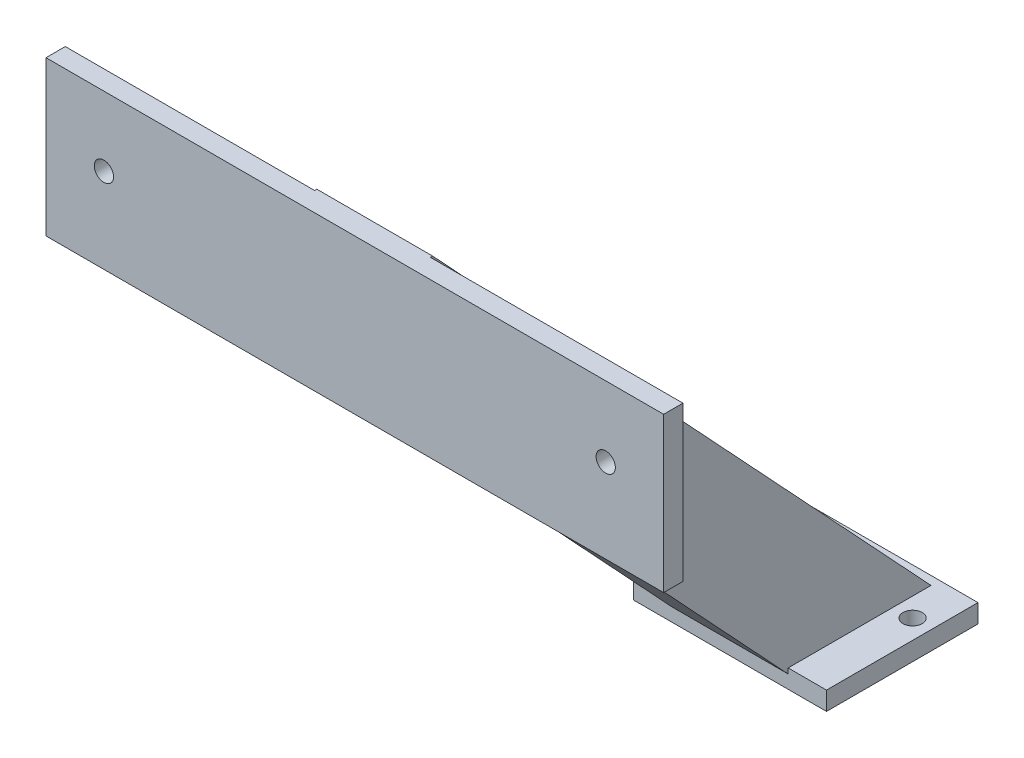
ISO-10303-21;
HEADER;
FILE_DESCRIPTION(('STEP AP214'),'2;1');
FILE_NAME('part.step','',(''),(''),'','','');
FILE_SCHEMA(('AUTOMOTIVE_DESIGN { 1 0 10303 214 1 1 1 1 }'));
ENDSEC;
DATA;
#1=APPLICATION_CONTEXT('core data for automotive mechanical design processes');
#2=APPLICATION_PROTOCOL_DEFINITION('international standard','automotive_design',2000,#1);
#3=PRODUCT_CONTEXT('',#1,'mechanical');
#4=PRODUCT('Part','Part','',(#3));
#5=PRODUCT_RELATED_PRODUCT_CATEGORY('part','',(#4));
#6=PRODUCT_DEFINITION_FORMATION('','',#4);
#7=PRODUCT_DEFINITION_CONTEXT('part definition',#1,'design');
#8=PRODUCT_DEFINITION('design','',#6,#7);
#9=PRODUCT_DEFINITION_SHAPE('','',#8);
#10=(LENGTH_UNIT() NAMED_UNIT(*) SI_UNIT(.MILLI.,.METRE.));
#11=(NAMED_UNIT(*) PLANE_ANGLE_UNIT() SI_UNIT($,.RADIAN.));
#12=(NAMED_UNIT(*) SI_UNIT($,.STERADIAN.) SOLID_ANGLE_UNIT());
#13=UNCERTAINTY_MEASURE_WITH_UNIT(LENGTH_MEASURE(1.E-05),#10,'distance_accuracy_value','');
#14=(GEOMETRIC_REPRESENTATION_CONTEXT(3) GLOBAL_UNCERTAINTY_ASSIGNED_CONTEXT((#13)) GLOBAL_UNIT_ASSIGNED_CONTEXT((#10,
#11,#12)) REPRESENTATION_CONTEXT('',''));
#15=CARTESIAN_POINT('',(0.,0.,0.));
#16=DIRECTION('',(0.,0.,1.));
#17=DIRECTION('',(1.,0.,0.));
#18=AXIS2_PLACEMENT_3D('',#15,#16,#17);
#19=CARTESIAN_POINT('',(-15.,29.5819050269431,2.8065790609284));
#20=DIRECTION('',(1.,0.,0.));
#21=DIRECTION('',(0.,0.,-1.));
#22=AXIS2_PLACEMENT_3D('',#19,#20,#21);
#23=PLANE('',#22);
#24=DIRECTION('',(0.,1.,0.));
#25=VECTOR('',#24,1.);
#26=CARTESIAN_POINT('',(-15.,29.5819050269431,-92.6751779747859));
#27=LINE('',#26,#25);
#28=CARTESIAN_POINT('',(-15.,-113.865560794245,-92.6751779747859));
#29=VERTEX_POINT('',#28);
#30=CARTESIAN_POINT('',(-15.,-112.503797371009,-92.6751779747859));
#31=VERTEX_POINT('',#30);
#32=EDGE_CURVE('E223',#29,#31,#27,.T.);
#33=ORIENTED_EDGE('',*,*,#32,.F.);
#34=DIRECTION('',(0.,0.731353701619169,0.6819983600625));
#35=VECTOR('',#34,1.);
#36=CARTESIAN_POINT('',(-15.,10.4859509451931,23.2844827062651));
#37=LINE('',#36,#35);
#38=CARTESIAN_POINT('',(-15.,-14.0500793261277,0.404264324328101));
#39=VERTEX_POINT('',#38);
#40=EDGE_CURVE('E253',#29,#39,#37,.T.);
#41=ORIENTED_EDGE('',*,*,#40,.T.);
#42=DIRECTION('',(0.,0.,-1.));
#43=VECTOR('',#42,1.);
#44=CARTESIAN_POINT('',(-15.,-14.0500793261277,5.));
#45=LINE('',#44,#43);
#46=CARTESIAN_POINT('',(-15.,-14.0500793261277,0.));
#47=VERTEX_POINT('',#46);
#48=EDGE_CURVE('E312',#39,#47,#45,.T.);
#49=ORIENTED_EDGE('',*,*,#48,.T.);
#50=DIRECTION('',(0.,1.,0.));
#51=VECTOR('',#50,1.);
#52=CARTESIAN_POINT('',(-15.,0.,0.));
#53=LINE('',#52,#51);
#54=CARTESIAN_POINT('',(-15.,25.9499206738723,0.));
#55=VERTEX_POINT('',#54);
#56=EDGE_CURVE('E249',#47,#55,#53,.T.);
#57=ORIENTED_EDGE('',*,*,#56,.T.);
#58=DIRECTION('',(0.,0.,1.));
#59=VECTOR('',#58,1.);
#60=CARTESIAN_POINT('',(-15.,25.9499206738723,-0.580301140926052));
#61=LINE('',#60,#59);
#62=CARTESIAN_POINT('',(-15.,25.9499206738723,-0.580301140926052));
#63=VERTEX_POINT('',#62);
#64=EDGE_CURVE('E328',#63,#55,#61,.T.);
#65=ORIENTED_EDGE('',*,*,#64,.F.);
#66=DIRECTION('',(0.,0.731353701619169,0.6819983600625));
#67=VECTOR('',#66,1.);
#68=CARTESIAN_POINT('',(-15.,29.5819050269431,2.8065790609284));
#69=LINE('',#68,#67);
#70=CARTESIAN_POINT('',(-15.,-112.503797371009,-129.690481949629));
#71=VERTEX_POINT('',#70);
#72=EDGE_CURVE('E324',#71,#63,#69,.T.);
#73=ORIENTED_EDGE('',*,*,#72,.F.);
#74=DIRECTION('',(0.,0.,-1.));
#75=VECTOR('',#74,1.);
#76=CARTESIAN_POINT('',(-15.,-112.503797371009,2.8065790609284));
#77=LINE('',#76,#75);
#78=EDGE_CURVE('E67',#31,#71,#77,.T.);
#79=ORIENTED_EDGE('',*,*,#78,.F.);
#80=EDGE_LOOP('',(#33,#41,#49,#57,#65,#73,#79));
#81=FACE_BOUND('',#80,.T.);
#82=ADVANCED_FACE('F43',(#81),#23,.F.);
#83=CARTESIAN_POINT('',(15.,29.5819050269431,2.8065790609284));
#84=DIRECTION('',(-1.,0.,0.));
#85=DIRECTION('',(0.,0.,1.));
#86=AXIS2_PLACEMENT_3D('',#83,#84,#85);
#87=PLANE('',#86);
#88=DIRECTION('',(0.,-1.,0.));
#89=VECTOR('',#88,1.);
#90=CARTESIAN_POINT('',(15.,29.5819050269431,-92.6751779747859));
#91=LINE('',#90,#89);
#92=CARTESIAN_POINT('',(15.,-112.503797371009,-92.6751779747859));
#93=VERTEX_POINT('',#92);
#94=CARTESIAN_POINT('',(15.,-113.865560794245,-92.6751779747859));
#95=VERTEX_POINT('',#94);
#96=EDGE_CURVE('E220',#93,#95,#91,.T.);
#97=ORIENTED_EDGE('',*,*,#96,.F.);
#98=DIRECTION('',(0.,0.,1.));
#99=VECTOR('',#98,1.);
#100=CARTESIAN_POINT('',(15.,-112.503797371009,2.8065790609284));
#101=LINE('',#100,#99);
#102=CARTESIAN_POINT('',(15.,-112.503797371009,-129.690481949629));
#103=VERTEX_POINT('',#102);
#104=EDGE_CURVE('E215',#103,#93,#101,.T.);
#105=ORIENTED_EDGE('',*,*,#104,.F.);
#106=DIRECTION('',(0.,-0.731353701619169,-0.6819983600625));
#107=VECTOR('',#106,1.);
#108=CARTESIAN_POINT('',(15.,29.5819050269431,2.8065790609284));
#109=LINE('',#108,#107);
#110=CARTESIAN_POINT('',(15.,25.9499206738723,-0.580301140926052));
#111=VERTEX_POINT('',#110);
#112=EDGE_CURVE('E320',#111,#103,#109,.T.);
#113=ORIENTED_EDGE('',*,*,#112,.F.);
#114=DIRECTION('',(0.,0.,1.));
#115=VECTOR('',#114,1.);
#116=CARTESIAN_POINT('',(15.,25.9499206738723,-0.580301140926052));
#117=LINE('',#116,#115);
#118=CARTESIAN_POINT('',(15.,25.9499206738723,0.));
#119=VERTEX_POINT('',#118);
#120=EDGE_CURVE('E259',#111,#119,#117,.T.);
#121=ORIENTED_EDGE('',*,*,#120,.T.);
#122=DIRECTION('',(0.,-1.,0.));
#123=VECTOR('',#122,1.);
#124=CARTESIAN_POINT('',(15.,0.,0.));
#125=LINE('',#124,#123);
#126=CARTESIAN_POINT('',(15.,-14.0500793261277,0.));
#127=VERTEX_POINT('',#126);
#128=EDGE_CURVE('E254',#119,#127,#125,.T.);
#129=ORIENTED_EDGE('',*,*,#128,.T.);
#130=DIRECTION('',(0.,0.,1.));
#131=VECTOR('',#130,1.);
#132=CARTESIAN_POINT('',(15.,-14.0500793261277,5.));
#133=LINE('',#132,#131);
#134=CARTESIAN_POINT('',(15.,-14.0500793261277,0.404264324328101));
#135=VERTEX_POINT('',#134);
#136=EDGE_CURVE('E258',#127,#135,#133,.T.);
#137=ORIENTED_EDGE('',*,*,#136,.T.);
#138=DIRECTION('',(0.,-0.731353701619169,-0.6819983600625));
#139=VECTOR('',#138,1.);
#140=CARTESIAN_POINT('',(15.,10.4859509451931,23.2844827062651));
#141=LINE('',#140,#139);
#142=EDGE_CURVE('E319',#135,#95,#141,.T.);
#143=ORIENTED_EDGE('',*,*,#142,.T.);
#144=EDGE_LOOP('',(#97,#105,#113,#121,#129,#137,#143));
#145=FACE_BOUND('',#144,.T.);
#146=ADVANCED_FACE('F392',(#145),#87,.F.);
#147=CARTESIAN_POINT('',(0.,-6.73663744663207,7.22415920854878));
#148=DIRECTION('',(0.,0.6819983600625,-0.731353701619169));
#149=DIRECTION('',(0.,0.731353701619169,0.6819983600625));
#150=AXIS2_PLACEMENT_3D('',#147,#148,#149);
#151=PLANE('',#150);
#152=DIRECTION('',(-1.,0.,0.));
#153=VECTOR('',#152,1.);
#154=CARTESIAN_POINT('',(0.,-113.865560794245,-92.6751779747859));
#155=LINE('',#154,#153);
#156=EDGE_CURVE('E11',#95,#29,#155,.T.);
#157=ORIENTED_EDGE('',*,*,#156,.F.);
#158=ORIENTED_EDGE('',*,*,#142,.F.);
#159=DIRECTION('',(-1.,0.,0.));
#160=VECTOR('',#159,1.);
#161=CARTESIAN_POINT('',(-79.5824804927821,-14.0500793261277,0.404264324328101));
#162=LINE('',#161,#160);
#163=EDGE_CURVE('E270',#135,#39,#162,.T.);
#164=ORIENTED_EDGE('',*,*,#163,.T.);
#165=ORIENTED_EDGE('',*,*,#40,.F.);
#166=EDGE_LOOP('',(#157,#158,#164,#165));
#167=FACE_BOUND('',#166,.T.);
#168=ADVANCED_FACE('F455',(#167),#151,.F.);
#169=CARTESIAN_POINT('',(0.,12.3593166351179,-13.253744436788));
#170=DIRECTION('',(0.,0.6819983600625,-0.731353701619169));
#171=DIRECTION('',(0.,0.731353701619169,0.6819983600625));
#172=AXIS2_PLACEMENT_3D('',#169,#170,#171);
#173=PLANE('',#172);
#174=ORIENTED_EDGE('',*,*,#112,.T.);
#175=DIRECTION('',(-1.,0.,0.));
#176=VECTOR('',#175,1.);
#177=CARTESIAN_POINT('',(0.,-112.503797371009,-129.690481949629));
#178=LINE('',#177,#176);
#179=EDGE_CURVE('E52',#103,#71,#178,.T.);
#180=ORIENTED_EDGE('',*,*,#179,.T.);
#181=ORIENTED_EDGE('',*,*,#72,.T.);
#182=DIRECTION('',(-1.,0.,0.));
#183=VECTOR('',#182,1.);
#184=CARTESIAN_POINT('',(15.,25.9499206738723,-0.580301140926052));
#185=LINE('',#184,#183);
#186=EDGE_CURVE('E329',#111,#63,#185,.T.);
#187=ORIENTED_EDGE('',*,*,#186,.F.);
#188=EDGE_LOOP('',(#174,#180,#181,#187));
#189=FACE_BOUND('',#188,.T.);
#190=ADVANCED_FACE('F352',(#189),#173,.T.);
#191=CARTESIAN_POINT('',(-79.5824804927821,-14.0500793261277,5.));
#192=DIRECTION('',(0.,1.,0.));
#193=DIRECTION('',(0.,0.,1.));
#194=AXIS2_PLACEMENT_3D('',#191,#192,#193);
#195=PLANE('',#194);
#196=ORIENTED_EDGE('',*,*,#48,.F.);
#197=ORIENTED_EDGE('',*,*,#163,.F.);
#198=ORIENTED_EDGE('',*,*,#136,.F.);
#199=DIRECTION('',(1.,0.,0.));
#200=VECTOR('',#199,1.);
#201=CARTESIAN_POINT('',(-79.5824804927821,-14.0500793261277,0.));
#202=LINE('',#201,#200);
#203=CARTESIAN_POINT('',(80.4175195072179,-14.0500793261277,0.));
#204=VERTEX_POINT('',#203);
#205=EDGE_CURVE('E265',#127,#204,#202,.T.);
#206=ORIENTED_EDGE('',*,*,#205,.T.);
#207=DIRECTION('',(0.,0.,-1.));
#208=VECTOR('',#207,1.);
#209=CARTESIAN_POINT('',(80.4175195072179,-14.0500793261277,5.));
#210=LINE('',#209,#208);
#211=CARTESIAN_POINT('',(80.4175195072179,-14.0500793261277,5.));
#212=VERTEX_POINT('',#211);
#213=EDGE_CURVE('E266',#212,#204,#210,.T.);
#214=ORIENTED_EDGE('',*,*,#213,.F.);
#215=DIRECTION('',(1.,0.,0.));
#216=VECTOR('',#215,1.);
#217=CARTESIAN_POINT('',(-79.5824804927821,-14.0500793261277,5.));
#218=LINE('',#217,#216);
#219=CARTESIAN_POINT('',(-79.5824804927821,-14.0500793261277,5.));
#220=VERTEX_POINT('',#219);
#221=EDGE_CURVE('E287',#220,#212,#218,.T.);
#222=ORIENTED_EDGE('',*,*,#221,.F.);
#223=DIRECTION('',(0.,0.,-1.));
#224=VECTOR('',#223,1.);
#225=CARTESIAN_POINT('',(-79.5824804927821,-14.0500793261277,5.));
#226=LINE('',#225,#224);
#227=CARTESIAN_POINT('',(-79.5824804927821,-14.0500793261277,0.));
#228=VERTEX_POINT('',#227);
#229=EDGE_CURVE('E260',#220,#228,#226,.T.);
#230=ORIENTED_EDGE('',*,*,#229,.T.);
#231=EDGE_CURVE('E264',#228,#47,#202,.T.);
#232=ORIENTED_EDGE('',*,*,#231,.T.);
#233=EDGE_LOOP('',(#196,#197,#198,#206,#214,#222,#230,#232));
#234=FACE_BOUND('',#233,.T.);
#235=ADVANCED_FACE('F367',(#234),#195,.F.);
#236=CARTESIAN_POINT('',(-79.5824804927821,25.9499206738723,5.));
#237=DIRECTION('',(0.,1.,0.));
#238=DIRECTION('',(0.,0.,1.));
#239=AXIS2_PLACEMENT_3D('',#236,#237,#238);
#240=PLANE('',#239);
#241=DIRECTION('',(1.,0.,0.));
#242=VECTOR('',#241,1.);
#243=CARTESIAN_POINT('',(-79.5824804927821,25.9499206738723,5.));
#244=LINE('',#243,#242);
#245=CARTESIAN_POINT('',(-79.5824804927821,25.9499206738723,5.));
#246=VERTEX_POINT('',#245);
#247=CARTESIAN_POINT('',(80.417519507218,25.9499206738723,5.));
#248=VERTEX_POINT('',#247);
#249=EDGE_CURVE('E277',#246,#248,#244,.T.);
#250=ORIENTED_EDGE('',*,*,#249,.T.);
#251=DIRECTION('',(0.,0.,-1.));
#252=VECTOR('',#251,1.);
#253=CARTESIAN_POINT('',(80.417519507218,25.9499206738723,5.));
#254=LINE('',#253,#252);
#255=CARTESIAN_POINT('',(80.417519507218,25.9499206738723,0.));
#256=VERTEX_POINT('',#255);
#257=EDGE_CURVE('E272',#248,#256,#254,.T.);
#258=ORIENTED_EDGE('',*,*,#257,.T.);
#259=DIRECTION('',(1.,0.,0.));
#260=VECTOR('',#259,1.);
#261=CARTESIAN_POINT('',(-79.5824804927821,25.9499206738723,0.));
#262=LINE('',#261,#260);
#263=EDGE_CURVE('E286',#119,#256,#262,.T.);
#264=ORIENTED_EDGE('',*,*,#263,.F.);
#265=ORIENTED_EDGE('',*,*,#120,.F.);
#266=ORIENTED_EDGE('',*,*,#186,.T.);
#267=ORIENTED_EDGE('',*,*,#64,.T.);
#268=CARTESIAN_POINT('',(-79.5824804927821,25.9499206738723,0.));
#269=VERTEX_POINT('',#268);
#270=EDGE_CURVE('E282',#269,#55,#262,.T.);
#271=ORIENTED_EDGE('',*,*,#270,.F.);
#272=DIRECTION('',(0.,0.,-1.));
#273=VECTOR('',#272,1.);
#274=CARTESIAN_POINT('',(-79.5824804927821,25.9499206738723,5.));
#275=LINE('',#274,#273);
#276=EDGE_CURVE('E278',#246,#269,#275,.T.);
#277=ORIENTED_EDGE('',*,*,#276,.F.);
#278=EDGE_LOOP('',(#250,#258,#264,#265,#266,#267,#271,#277));
#279=FACE_BOUND('',#278,.T.);
#280=ADVANCED_FACE('F378',(#279),#240,.T.);
#281=CARTESIAN_POINT('',(0.,0.,5.));
#282=DIRECTION('',(0.,0.,1.));
#283=DIRECTION('',(1.,0.,0.));
#284=AXIS2_PLACEMENT_3D('',#281,#282,#283);
#285=PLANE('',#284);
#286=CARTESIAN_POINT('',(65.4175195072179,7.73826469051745,5.));
#287=DIRECTION('',(0.,0.,1.));
#288=DIRECTION('',(1.,0.,0.));
#289=AXIS2_PLACEMENT_3D('',#286,#287,#288);
#290=CIRCLE('',#289,2.5);
#291=CARTESIAN_POINT('',(67.9175195072179,7.73826469051745,5.));
#292=VERTEX_POINT('',#291);
#293=EDGE_CURVE('E238',#292,#292,#290,.T.);
#294=ORIENTED_EDGE('',*,*,#293,.F.);
#295=EDGE_LOOP('',(#294));
#296=FACE_BOUND('',#295,.T.);
#297=CARTESIAN_POINT('',(-64.5824804927821,7.969479132061,5.));
#298=DIRECTION('',(0.,0.,1.));
#299=DIRECTION('',(1.,0.,0.));
#300=AXIS2_PLACEMENT_3D('',#297,#298,#299);
#301=CIRCLE('',#300,2.5);
#302=CARTESIAN_POINT('',(-62.0824804927821,7.969479132061,5.));
#303=VERTEX_POINT('',#302);
#304=EDGE_CURVE('E245',#303,#303,#301,.T.);
#305=ORIENTED_EDGE('',*,*,#304,.F.);
#306=EDGE_LOOP('',(#305));
#307=FACE_BOUND('',#306,.T.);
#308=DIRECTION('',(0.,-1.,0.));
#309=VECTOR('',#308,1.);
#310=CARTESIAN_POINT('',(80.417519507218,25.9499206738723,5.));
#311=LINE('',#310,#309);
#312=EDGE_CURVE('E271',#248,#212,#311,.T.);
#313=ORIENTED_EDGE('',*,*,#312,.F.);
#314=ORIENTED_EDGE('',*,*,#249,.F.);
#315=DIRECTION('',(0.,-1.,0.));
#316=VECTOR('',#315,1.);
#317=CARTESIAN_POINT('',(-79.5824804927821,25.9499206738723,5.));
#318=LINE('',#317,#316);
#319=EDGE_CURVE('E276',#246,#220,#318,.T.);
#320=ORIENTED_EDGE('',*,*,#319,.T.);
#321=ORIENTED_EDGE('',*,*,#221,.T.);
#322=EDGE_LOOP('',(#313,#314,#320,#321));
#323=FACE_BOUND('',#322,.T.);
#324=ADVANCED_FACE('F381',(#296,#307,#323),#285,.T.);
#325=CARTESIAN_POINT('',(0.,0.,0.));
#326=DIRECTION('',(0.,0.,1.));
#327=DIRECTION('',(1.,0.,0.));
#328=AXIS2_PLACEMENT_3D('',#325,#326,#327);
#329=PLANE('',#328);
#330=CARTESIAN_POINT('',(-64.5824804927821,7.969479132061,0.));
#331=DIRECTION('',(0.,0.,-1.));
#332=DIRECTION('',(-1.,0.,0.));
#333=AXIS2_PLACEMENT_3D('',#330,#331,#332);
#334=CIRCLE('',#333,2.5);
#335=CARTESIAN_POINT('',(-67.0824804927821,7.969479132061,0.));
#336=VERTEX_POINT('',#335);
#337=EDGE_CURVE('E233',#336,#336,#334,.T.);
#338=ORIENTED_EDGE('',*,*,#337,.F.);
#339=EDGE_LOOP('',(#338));
#340=FACE_BOUND('',#339,.T.);
#341=ORIENTED_EDGE('',*,*,#56,.F.);
#342=ORIENTED_EDGE('',*,*,#231,.F.);
#343=DIRECTION('',(0.,-1.,0.));
#344=VECTOR('',#343,1.);
#345=CARTESIAN_POINT('',(-79.5824804927821,25.9499206738723,0.));
#346=LINE('',#345,#344);
#347=EDGE_CURVE('E281',#269,#228,#346,.T.);
#348=ORIENTED_EDGE('',*,*,#347,.F.);
#349=ORIENTED_EDGE('',*,*,#270,.T.);
#350=EDGE_LOOP('',(#341,#342,#348,#349));
#351=FACE_BOUND('',#350,.T.);
#352=ADVANCED_FACE('F389',(#340,#351),#329,.F.);
#353=CARTESIAN_POINT('',(65.4175195072179,7.73826469051745,0.));
#354=DIRECTION('',(0.,0.,-1.));
#355=DIRECTION('',(-1.,0.,0.));
#356=AXIS2_PLACEMENT_3D('',#353,#354,#355);
#357=CIRCLE('',#356,2.5);
#358=CARTESIAN_POINT('',(62.9175195072179,7.73826469051745,0.));
#359=VERTEX_POINT('',#358);
#360=EDGE_CURVE('E234',#359,#359,#357,.T.);
#361=ORIENTED_EDGE('',*,*,#360,.F.);
#362=EDGE_LOOP('',(#361));
#363=FACE_BOUND('',#362,.T.);
#364=ORIENTED_EDGE('',*,*,#128,.F.);
#365=ORIENTED_EDGE('',*,*,#263,.T.);
#366=DIRECTION('',(0.,-1.,0.));
#367=VECTOR('',#366,1.);
#368=CARTESIAN_POINT('',(80.417519507218,25.9499206738723,0.));
#369=LINE('',#368,#367);
#370=EDGE_CURVE('E288',#256,#204,#369,.T.);
#371=ORIENTED_EDGE('',*,*,#370,.T.);
#372=ORIENTED_EDGE('',*,*,#205,.F.);
#373=EDGE_LOOP('',(#364,#365,#371,#372));
#374=FACE_BOUND('',#373,.T.);
#375=ADVANCED_FACE('F375',(#363,#374),#329,.F.);
#376=CARTESIAN_POINT('',(-79.5824804927821,25.9499206738723,5.));
#377=DIRECTION('',(1.,0.,0.));
#378=DIRECTION('',(0.,0.,-1.));
#379=AXIS2_PLACEMENT_3D('',#376,#377,#378);
#380=PLANE('',#379);
#381=ORIENTED_EDGE('',*,*,#347,.T.);
#382=ORIENTED_EDGE('',*,*,#229,.F.);
#383=ORIENTED_EDGE('',*,*,#319,.F.);
#384=ORIENTED_EDGE('',*,*,#276,.T.);
#385=EDGE_LOOP('',(#381,#382,#383,#384));
#386=FACE_BOUND('',#385,.T.);
#387=ADVANCED_FACE('F386',(#386),#380,.F.);
#388=CARTESIAN_POINT('',(80.417519507218,25.9499206738723,5.));
#389=DIRECTION('',(1.,0.,0.));
#390=DIRECTION('',(0.,1.,0.));
#391=AXIS2_PLACEMENT_3D('',#388,#389,#390);
#392=PLANE('',#391);
#393=ORIENTED_EDGE('',*,*,#370,.F.);
#394=ORIENTED_EDGE('',*,*,#257,.F.);
#395=ORIENTED_EDGE('',*,*,#312,.T.);
#396=ORIENTED_EDGE('',*,*,#213,.T.);
#397=EDGE_LOOP('',(#393,#394,#395,#396));
#398=FACE_BOUND('',#397,.T.);
#399=ADVANCED_FACE('F372',(#398),#392,.T.);
#400=CARTESIAN_POINT('',(65.4175195072179,7.73826469051745,6.82499128661151));
#401=DIRECTION('',(0.,0.,-1.));
#402=DIRECTION('',(-1.,0.,0.));
#403=AXIS2_PLACEMENT_3D('',#400,#401,#402);
#404=CYLINDRICAL_SURFACE('',#403,2.5);
#405=ORIENTED_EDGE('',*,*,#293,.T.);
#406=EDGE_LOOP('',(#405));
#407=FACE_BOUND('',#406,.T.);
#408=ORIENTED_EDGE('',*,*,#360,.T.);
#409=EDGE_LOOP('',(#408));
#410=FACE_BOUND('',#409,.T.);
#411=ADVANCED_FACE('F484',(#407,#410),#404,.F.);
#412=CARTESIAN_POINT('',(-64.5824804927821,7.969479132061,6.82499128661151));
#413=DIRECTION('',(0.,0.,-1.));
#414=DIRECTION('',(-1.,0.,0.));
#415=AXIS2_PLACEMENT_3D('',#412,#413,#414);
#416=CYLINDRICAL_SURFACE('',#415,2.5);
#417=ORIENTED_EDGE('',*,*,#304,.T.);
#418=EDGE_LOOP('',(#417));
#419=FACE_BOUND('',#418,.T.);
#420=ORIENTED_EDGE('',*,*,#337,.T.);
#421=EDGE_LOOP('',(#420));
#422=FACE_BOUND('',#421,.T.);
#423=ADVANCED_FACE('F487',(#419,#422),#416,.F.);
#424=CARTESIAN_POINT('',(-25.068347329402,-117.303797371009,-92.6751779747859));
#425=DIRECTION('',(0.,0.,-1.));
#426=DIRECTION('',(-1.,0.,0.));
#427=AXIS2_PLACEMENT_3D('',#424,#425,#426);
#428=PLANE('',#427);
#429=ORIENTED_EDGE('',*,*,#156,.T.);
#430=ORIENTED_EDGE('',*,*,#32,.T.);
#431=DIRECTION('',(-1.,0.,0.));
#432=VECTOR('',#431,1.);
#433=CARTESIAN_POINT('',(-25.068347329402,-112.503797371009,-92.6751779747859));
#434=LINE('',#433,#432);
#435=CARTESIAN_POINT('',(-25.068347329402,-112.503797371009,-92.6751779747859));
#436=VERTEX_POINT('',#435);
#437=EDGE_CURVE('E398',#31,#436,#434,.T.);
#438=ORIENTED_EDGE('',*,*,#437,.T.);
#439=DIRECTION('',(0.,1.,0.));
#440=VECTOR('',#439,1.);
#441=CARTESIAN_POINT('',(-25.068347329402,-117.303797371009,-92.6751779747859));
#442=LINE('',#441,#440);
#443=CARTESIAN_POINT('',(-25.068347329402,-117.303797371009,-92.6751779747859));
#444=VERTEX_POINT('',#443);
#445=EDGE_CURVE('E178',#444,#436,#442,.T.);
#446=ORIENTED_EDGE('',*,*,#445,.F.);
#447=DIRECTION('',(-1.,0.,0.));
#448=VECTOR('',#447,1.);
#449=CARTESIAN_POINT('',(-25.068347329402,-117.303797371009,-92.6751779747859));
#450=LINE('',#449,#448);
#451=CARTESIAN_POINT('',(24.931652670598,-117.303797371009,-92.6751779747859));
#452=VERTEX_POINT('',#451);
#453=EDGE_CURVE('E170',#452,#444,#450,.T.);
#454=ORIENTED_EDGE('',*,*,#453,.F.);
#455=DIRECTION('',(0.,1.,0.));
#456=VECTOR('',#455,1.);
#457=CARTESIAN_POINT('',(24.931652670598,-117.303797371009,-92.6751779747859));
#458=LINE('',#457,#456);
#459=CARTESIAN_POINT('',(24.931652670598,-112.503797371009,-92.6751779747859));
#460=VERTEX_POINT('',#459);
#461=EDGE_CURVE('E175',#452,#460,#458,.T.);
#462=ORIENTED_EDGE('',*,*,#461,.T.);
#463=EDGE_CURVE('E394',#460,#93,#434,.T.);
#464=ORIENTED_EDGE('',*,*,#463,.T.);
#465=ORIENTED_EDGE('',*,*,#96,.T.);
#466=EDGE_LOOP('',(#429,#430,#438,#446,#454,#462,#464,#465));
#467=FACE_BOUND('',#466,.T.);
#468=ADVANCED_FACE('F172',(#467),#428,.F.);
#469=CARTESIAN_POINT('',(0.,-112.503797371009,0.));
#470=DIRECTION('',(0.,-1.,0.));
#471=DIRECTION('',(0.,0.,-1.));
#472=AXIS2_PLACEMENT_3D('',#469,#470,#471);
#473=PLANE('',#472);
#474=CARTESIAN_POINT('',(19.931652670598,-112.503797371009,-119.978116152217));
#475=DIRECTION('',(0.,1.,0.));
#476=DIRECTION('',(0.,0.,1.));
#477=AXIS2_PLACEMENT_3D('',#474,#475,#476);
#478=CIRCLE('',#477,2.5);
#479=CARTESIAN_POINT('',(19.931652670598,-112.503797371009,-117.478116152217));
#480=VERTEX_POINT('',#479);
#481=EDGE_CURVE('E422',#480,#480,#478,.T.);
#482=ORIENTED_EDGE('',*,*,#481,.F.);
#483=EDGE_LOOP('',(#482));
#484=FACE_BOUND('',#483,.T.);
#485=CARTESIAN_POINT('',(-20.068347329402,-112.503797371009,-119.907329329837));
#486=DIRECTION('',(0.,1.,0.));
#487=DIRECTION('',(0.,0.,1.));
#488=AXIS2_PLACEMENT_3D('',#485,#486,#487);
#489=CIRCLE('',#488,2.5);
#490=CARTESIAN_POINT('',(-20.068347329402,-112.503797371009,-117.407329329837));
#491=VERTEX_POINT('',#490);
#492=EDGE_CURVE('E428',#491,#491,#489,.T.);
#493=ORIENTED_EDGE('',*,*,#492,.F.);
#494=EDGE_LOOP('',(#493));
#495=FACE_BOUND('',#494,.T.);
#496=ORIENTED_EDGE('',*,*,#437,.F.);
#497=ORIENTED_EDGE('',*,*,#78,.T.);
#498=ORIENTED_EDGE('',*,*,#179,.F.);
#499=ORIENTED_EDGE('',*,*,#104,.T.);
#500=ORIENTED_EDGE('',*,*,#463,.F.);
#501=DIRECTION('',(0.,0.,1.));
#502=VECTOR('',#501,1.);
#503=CARTESIAN_POINT('',(24.931652670598,-112.503797371009,-92.6751779747859));
#504=LINE('',#503,#502);
#505=CARTESIAN_POINT('',(24.931652670598,-112.503797371009,-131.927234447004));
#506=VERTEX_POINT('',#505);
#507=EDGE_CURVE('E197',#506,#460,#504,.T.);
#508=ORIENTED_EDGE('',*,*,#507,.F.);
#509=DIRECTION('',(1.,0.,0.));
#510=VECTOR('',#509,1.);
#511=CARTESIAN_POINT('',(-25.068347329402,-112.503797371009,-131.927234447004));
#512=LINE('',#511,#510);
#513=CARTESIAN_POINT('',(-25.068347329402,-112.503797371009,-131.927234447004));
#514=VERTEX_POINT('',#513);
#515=EDGE_CURVE('E193',#514,#506,#512,.T.);
#516=ORIENTED_EDGE('',*,*,#515,.F.);
#517=DIRECTION('',(0.,0.,-1.));
#518=VECTOR('',#517,1.);
#519=CARTESIAN_POINT('',(-25.068347329402,-112.503797371009,-92.6751779747859));
#520=LINE('',#519,#518);
#521=EDGE_CURVE('E397',#436,#514,#520,.T.);
#522=ORIENTED_EDGE('',*,*,#521,.F.);
#523=EDGE_LOOP('',(#496,#497,#498,#499,#500,#508,#516,#522));
#524=FACE_BOUND('',#523,.T.);
#525=ADVANCED_FACE('F393',(#484,#495,#524),#473,.F.);
#526=CARTESIAN_POINT('',(24.931652670598,-117.303797371009,-92.6751779747859));
#527=DIRECTION('',(-1.,0.,0.));
#528=DIRECTION('',(0.,0.,1.));
#529=AXIS2_PLACEMENT_3D('',#526,#527,#528);
#530=PLANE('',#529);
#531=ORIENTED_EDGE('',*,*,#507,.T.);
#532=ORIENTED_EDGE('',*,*,#461,.F.);
#533=DIRECTION('',(0.,0.,1.));
#534=VECTOR('',#533,1.);
#535=CARTESIAN_POINT('',(24.931652670598,-117.303797371009,-92.6751779747859));
#536=LINE('',#535,#534);
#537=CARTESIAN_POINT('',(24.931652670598,-117.303797371009,-131.927234447004));
#538=VERTEX_POINT('',#537);
#539=EDGE_CURVE('E183',#538,#452,#536,.T.);
#540=ORIENTED_EDGE('',*,*,#539,.F.);
#541=DIRECTION('',(0.,1.,0.));
#542=VECTOR('',#541,1.);
#543=CARTESIAN_POINT('',(24.931652670598,-117.303797371009,-131.927234447004));
#544=LINE('',#543,#542);
#545=EDGE_CURVE('E408',#538,#506,#544,.T.);
#546=ORIENTED_EDGE('',*,*,#545,.T.);
#547=EDGE_LOOP('',(#531,#532,#540,#546));
#548=FACE_BOUND('',#547,.T.);
#549=ADVANCED_FACE('F195',(#548),#530,.F.);
#550=CARTESIAN_POINT('',(-25.068347329402,-117.303797371009,-92.6751779747859));
#551=DIRECTION('',(1.,0.,0.));
#552=DIRECTION('',(0.,0.,-1.));
#553=AXIS2_PLACEMENT_3D('',#550,#551,#552);
#554=PLANE('',#553);
#555=ORIENTED_EDGE('',*,*,#521,.T.);
#556=DIRECTION('',(0.,1.,0.));
#557=VECTOR('',#556,1.);
#558=CARTESIAN_POINT('',(-25.068347329402,-117.303797371009,-131.927234447004));
#559=LINE('',#558,#557);
#560=CARTESIAN_POINT('',(-25.068347329402,-117.303797371009,-131.927234447004));
#561=VERTEX_POINT('',#560);
#562=EDGE_CURVE('E206',#561,#514,#559,.T.);
#563=ORIENTED_EDGE('',*,*,#562,.F.);
#564=DIRECTION('',(0.,0.,-1.));
#565=VECTOR('',#564,1.);
#566=CARTESIAN_POINT('',(-25.068347329402,-117.303797371009,-92.6751779747859));
#567=LINE('',#566,#565);
#568=EDGE_CURVE('E182',#444,#561,#567,.T.);
#569=ORIENTED_EDGE('',*,*,#568,.F.);
#570=ORIENTED_EDGE('',*,*,#445,.T.);
#571=EDGE_LOOP('',(#555,#563,#569,#570));
#572=FACE_BOUND('',#571,.T.);
#573=ADVANCED_FACE('F440',(#572),#554,.F.);
#574=CARTESIAN_POINT('',(-25.068347329402,-117.303797371009,-131.927234447004));
#575=DIRECTION('',(0.,0.,1.));
#576=DIRECTION('',(1.,0.,0.));
#577=AXIS2_PLACEMENT_3D('',#574,#575,#576);
#578=PLANE('',#577);
#579=DIRECTION('',(1.,0.,0.));
#580=VECTOR('',#579,1.);
#581=CARTESIAN_POINT('',(0.,-114.902420761264,-131.927234447004));
#582=LINE('',#581,#580);
#583=CARTESIAN_POINT('',(-15.,-114.902420761264,-131.927234447004));
#584=VERTEX_POINT('',#583);
#585=CARTESIAN_POINT('',(15.,-114.902420761264,-131.927234447004));
#586=VERTEX_POINT('',#585);
#587=EDGE_CURVE('E59',#584,#586,#582,.T.);
#588=ORIENTED_EDGE('',*,*,#587,.F.);
#589=DIRECTION('',(0.,-1.,0.));
#590=VECTOR('',#589,1.);
#591=CARTESIAN_POINT('',(-15.,29.5819050269431,-131.927234447004));
#592=LINE('',#591,#590);
#593=CARTESIAN_POINT('',(-15.,-114.903797371009,-131.927234447004));
#594=VERTEX_POINT('',#593);
#595=EDGE_CURVE('E204',#584,#594,#592,.T.);
#596=ORIENTED_EDGE('',*,*,#595,.T.);
#597=DIRECTION('',(1.,0.,0.));
#598=VECTOR('',#597,1.);
#599=CARTESIAN_POINT('',(-79.5824804927821,-114.903797371009,-131.927234447004));
#600=LINE('',#599,#598);
#601=CARTESIAN_POINT('',(15.,-114.903797371009,-131.927234447004));
#602=VERTEX_POINT('',#601);
#603=EDGE_CURVE('E346',#594,#602,#600,.T.);
#604=ORIENTED_EDGE('',*,*,#603,.T.);
#605=DIRECTION('',(0.,1.,0.));
#606=VECTOR('',#605,1.);
#607=CARTESIAN_POINT('',(15.,29.5819050269431,-131.927234447004));
#608=LINE('',#607,#606);
#609=EDGE_CURVE('E199',#602,#586,#608,.T.);
#610=ORIENTED_EDGE('',*,*,#609,.T.);
#611=EDGE_LOOP('',(#588,#596,#604,#610));
#612=FACE_BOUND('',#611,.T.);
#613=ORIENTED_EDGE('',*,*,#515,.T.);
#614=ORIENTED_EDGE('',*,*,#545,.F.);
#615=DIRECTION('',(1.,0.,0.));
#616=VECTOR('',#615,1.);
#617=CARTESIAN_POINT('',(-25.068347329402,-117.303797371009,-131.927234447004));
#618=LINE('',#617,#616);
#619=EDGE_CURVE('E188',#561,#538,#618,.T.);
#620=ORIENTED_EDGE('',*,*,#619,.F.);
#621=ORIENTED_EDGE('',*,*,#562,.T.);
#622=EDGE_LOOP('',(#613,#614,#620,#621));
#623=FACE_BOUND('',#622,.T.);
#624=ADVANCED_FACE('F415',(#612,#623),#578,.F.);
#625=CARTESIAN_POINT('',(0.,-117.303797371009,0.));
#626=DIRECTION('',(0.,-1.,0.));
#627=DIRECTION('',(0.,0.,-1.));
#628=AXIS2_PLACEMENT_3D('',#625,#626,#627);
#629=PLANE('',#628);
#630=CARTESIAN_POINT('',(19.931652670598,-117.303797371009,-119.978116152217));
#631=DIRECTION('',(0.,1.,0.));
#632=DIRECTION('',(0.,0.,1.));
#633=AXIS2_PLACEMENT_3D('',#630,#631,#632);
#634=CIRCLE('',#633,2.5);
#635=CARTESIAN_POINT('',(19.931652670598,-117.303797371009,-117.478116152217));
#636=VERTEX_POINT('',#635);
#637=EDGE_CURVE('E419',#636,#636,#634,.T.);
#638=ORIENTED_EDGE('',*,*,#637,.T.);
#639=EDGE_LOOP('',(#638));
#640=FACE_BOUND('',#639,.T.);
#641=CARTESIAN_POINT('',(-20.068347329402,-117.303797371009,-119.907329329837));
#642=DIRECTION('',(0.,1.,0.));
#643=DIRECTION('',(0.,0.,1.));
#644=AXIS2_PLACEMENT_3D('',#641,#642,#643);
#645=CIRCLE('',#644,2.5);
#646=CARTESIAN_POINT('',(-20.068347329402,-117.303797371009,-117.407329329837));
#647=VERTEX_POINT('',#646);
#648=EDGE_CURVE('E434',#647,#647,#645,.T.);
#649=ORIENTED_EDGE('',*,*,#648,.T.);
#650=EDGE_LOOP('',(#649));
#651=FACE_BOUND('',#650,.T.);
#652=ORIENTED_EDGE('',*,*,#539,.T.);
#653=ORIENTED_EDGE('',*,*,#453,.T.);
#654=ORIENTED_EDGE('',*,*,#568,.T.);
#655=ORIENTED_EDGE('',*,*,#619,.T.);
#656=EDGE_LOOP('',(#652,#653,#654,#655));
#657=FACE_BOUND('',#656,.T.);
#658=ADVANCED_FACE('F186',(#640,#651,#657),#629,.T.);
#659=CARTESIAN_POINT('',(-79.5824804927821,-114.903797371009,-132.630964828264));
#660=DIRECTION('',(0.,1.,0.));
#661=DIRECTION('',(0.,0.,1.));
#662=AXIS2_PLACEMENT_3D('',#659,#660,#661);
#663=PLANE('',#662);
#664=ORIENTED_EDGE('',*,*,#603,.F.);
#665=DIRECTION('',(0.,0.,1.));
#666=VECTOR('',#665,1.);
#667=CARTESIAN_POINT('',(-15.,-114.903797371009,2.8065790609284));
#668=LINE('',#667,#666);
#669=CARTESIAN_POINT('',(-15.,-114.903797371009,-131.928518156359));
#670=VERTEX_POINT('',#669);
#671=EDGE_CURVE('E229',#670,#594,#668,.T.);
#672=ORIENTED_EDGE('',*,*,#671,.F.);
#673=DIRECTION('',(1.,0.,0.));
#674=VECTOR('',#673,1.);
#675=CARTESIAN_POINT('',(0.,-114.903797371009,-131.928518156359));
#676=LINE('',#675,#674);
#677=CARTESIAN_POINT('',(15.,-114.903797371009,-131.928518156359));
#678=VERTEX_POINT('',#677);
#679=EDGE_CURVE('E333',#670,#678,#676,.T.);
#680=ORIENTED_EDGE('',*,*,#679,.T.);
#681=DIRECTION('',(0.,0.,1.));
#682=VECTOR('',#681,1.);
#683=CARTESIAN_POINT('',(15.,-114.903797371009,-132.630964828264));
#684=LINE('',#683,#682);
#685=EDGE_CURVE('E226',#678,#602,#684,.T.);
#686=ORIENTED_EDGE('',*,*,#685,.T.);
#687=EDGE_LOOP('',(#664,#672,#680,#686));
#688=FACE_BOUND('',#687,.T.);
#689=ADVANCED_FACE('F474',(#688),#663,.F.);
#690=EDGE_CURVE('E325',#670,#584,#69,.T.);
#691=ORIENTED_EDGE('',*,*,#690,.T.);
#692=ORIENTED_EDGE('',*,*,#587,.T.);
#693=EDGE_CURVE('E311',#586,#678,#109,.T.);
#694=ORIENTED_EDGE('',*,*,#693,.T.);
#695=ORIENTED_EDGE('',*,*,#679,.F.);
#696=EDGE_LOOP('',(#691,#692,#694,#695));
#697=FACE_BOUND('',#696,.T.);
#698=ADVANCED_FACE('F467',(#697),#173,.T.);
#699=ORIENTED_EDGE('',*,*,#609,.F.);
#700=ORIENTED_EDGE('',*,*,#685,.F.);
#701=ORIENTED_EDGE('',*,*,#693,.F.);
#702=EDGE_LOOP('',(#699,#700,#701));
#703=FACE_BOUND('',#702,.T.);
#704=ADVANCED_FACE('F456',(#703),#87,.F.);
#705=ORIENTED_EDGE('',*,*,#595,.F.);
#706=ORIENTED_EDGE('',*,*,#690,.F.);
#707=ORIENTED_EDGE('',*,*,#671,.T.);
#708=EDGE_LOOP('',(#705,#706,#707));
#709=FACE_BOUND('',#708,.T.);
#710=ADVANCED_FACE('F45',(#709),#23,.F.);
#711=CARTESIAN_POINT('',(-20.068347329402,-117.303797371009,-119.907329329837));
#712=DIRECTION('',(0.,1.,0.));
#713=DIRECTION('',(0.,0.,1.));
#714=AXIS2_PLACEMENT_3D('',#711,#712,#713);
#715=CYLINDRICAL_SURFACE('',#714,2.5);
#716=ORIENTED_EDGE('',*,*,#648,.F.);
#717=EDGE_LOOP('',(#716));
#718=FACE_BOUND('',#717,.T.);
#719=ORIENTED_EDGE('',*,*,#492,.T.);
#720=EDGE_LOOP('',(#719));
#721=FACE_BOUND('',#720,.T.);
#722=ADVANCED_FACE('F458',(#718,#721),#715,.F.);
#723=CARTESIAN_POINT('',(19.931652670598,-117.303797371009,-119.978116152217));
#724=DIRECTION('',(0.,1.,0.));
#725=DIRECTION('',(0.,0.,1.));
#726=AXIS2_PLACEMENT_3D('',#723,#724,#725);
#727=CYLINDRICAL_SURFACE('',#726,2.5);
#728=ORIENTED_EDGE('',*,*,#637,.F.);
#729=EDGE_LOOP('',(#728));
#730=FACE_BOUND('',#729,.T.);
#731=ORIENTED_EDGE('',*,*,#481,.T.);
#732=EDGE_LOOP('',(#731));
#733=FACE_BOUND('',#732,.T.);
#734=ADVANCED_FACE('F464',(#730,#733),#727,.F.);
#735=CLOSED_SHELL('',(#82,#146,#168,#190,#235,#280,#324,#352,#375,#387,#399,#411,#423,#468,#525,
#549,#573,#624,#658,#689,#698,#704,#710,#722,#734));
#736=MANIFOLD_SOLID_BREP('B2',#735);
#737=ADVANCED_BREP_SHAPE_REPRESENTATION('',(#18,#736),#14);
#738=SHAPE_DEFINITION_REPRESENTATION(#9,#737);
ENDSEC;
END-ISO-10303-21;
